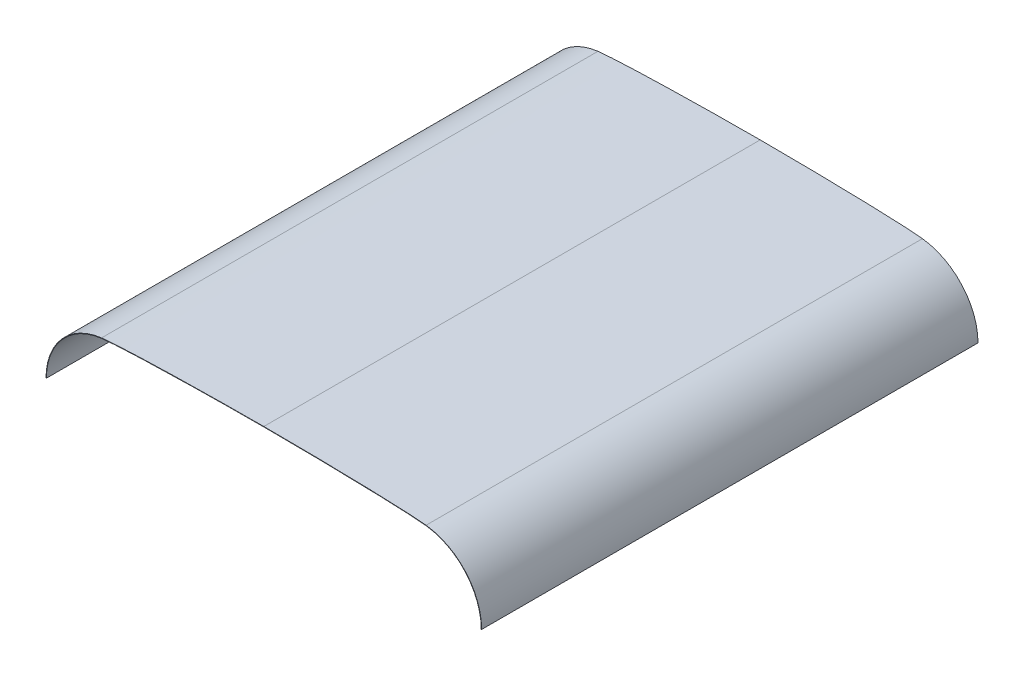
ISO-10303-21;
HEADER;
FILE_DESCRIPTION(('STEP AP214'),'2;1');
FILE_NAME('part.step','',(''),(''),'','','');
FILE_SCHEMA(('AUTOMOTIVE_DESIGN { 1 0 10303 214 1 1 1 1 }'));
ENDSEC;
DATA;
#1=APPLICATION_CONTEXT('core data for automotive mechanical design processes');
#2=APPLICATION_PROTOCOL_DEFINITION('international standard','automotive_design',2000,#1);
#3=PRODUCT_CONTEXT('',#1,'mechanical');
#4=PRODUCT('Part','Part','',(#3));
#5=PRODUCT_RELATED_PRODUCT_CATEGORY('part','',(#4));
#6=PRODUCT_DEFINITION_FORMATION('','',#4);
#7=PRODUCT_DEFINITION_CONTEXT('part definition',#1,'design');
#8=PRODUCT_DEFINITION('design','',#6,#7);
#9=PRODUCT_DEFINITION_SHAPE('','',#8);
#10=(LENGTH_UNIT() NAMED_UNIT(*) SI_UNIT(.MILLI.,.METRE.));
#11=(NAMED_UNIT(*) PLANE_ANGLE_UNIT() SI_UNIT($,.RADIAN.));
#12=(NAMED_UNIT(*) SI_UNIT($,.STERADIAN.) SOLID_ANGLE_UNIT());
#13=UNCERTAINTY_MEASURE_WITH_UNIT(LENGTH_MEASURE(1.E-05),#10,'distance_accuracy_value','');
#14=(GEOMETRIC_REPRESENTATION_CONTEXT(3) GLOBAL_UNCERTAINTY_ASSIGNED_CONTEXT((#13)) GLOBAL_UNIT_ASSIGNED_CONTEXT((#10,
#11,#12)) REPRESENTATION_CONTEXT('',''));
#15=CARTESIAN_POINT('',(0.,0.,0.));
#16=DIRECTION('',(0.,0.,1.));
#17=DIRECTION('',(1.,0.,0.));
#18=AXIS2_PLACEMENT_3D('',#15,#16,#17);
#19=CARTESIAN_POINT('',(1875.,2.22044604925031E-13,0.));
#20=DIRECTION('',(0.,0.,1.));
#21=DIRECTION('',(1.,0.,0.));
#22=AXIS2_PLACEMENT_3D('',#19,#20,#21);
#23=PLANE('',#22);
#24=CARTESIAN_POINT('',(1875.,2.22044604925031E-13,0.));
#25=DIRECTION('',(0.,0.,-1.));
#26=DIRECTION('',(1.,0.,0.));
#27=AXIS2_PLACEMENT_3D('',#24,#25,#26);
#28=CIRCLE('',#27,315.);
#29=CARTESIAN_POINT('',(1911.91539869116,312.829431702761,0.));
#30=VERTEX_POINT('',#29);
#31=CARTESIAN_POINT('',(2190.,0.,0.));
#32=VERTEX_POINT('',#31);
#33=EDGE_CURVE('E184',#30,#32,#28,.T.);
#34=ORIENTED_EDGE('',*,*,#33,.F.);
#35=CARTESIAN_POINT('',(1095.,335.,0.));
#36=CARTESIAN_POINT('',(1377.51055032075,335.,0.));
#37=CARTESIAN_POINT('',(1798.45071959907,326.218817232283,0.));
#38=CARTESIAN_POINT('',(1911.91539869116,312.829431702761,0.));
#39=B_SPLINE_CURVE_WITH_KNOTS('',3,(#35,#36,#37,#38),.UNSPECIFIED.,.F.,.F.,(4,4),(0.,1.),.UNSPECIFIED.);
#40=CARTESIAN_POINT('',(1095.,335.,0.));
#41=VERTEX_POINT('',#40);
#42=EDGE_CURVE('E169',#41,#30,#39,.T.);
#43=ORIENTED_EDGE('',*,*,#42,.F.);
#44=CARTESIAN_POINT('',(278.084601308835,312.829431702761,0.));
#45=CARTESIAN_POINT('',(391.549280400928,326.218817232283,0.));
#46=CARTESIAN_POINT('',(812.489449679245,335.,0.));
#47=CARTESIAN_POINT('',(1095.,335.,0.));
#48=B_SPLINE_CURVE_WITH_KNOTS('',3,(#44,#45,#46,#47),.UNSPECIFIED.,.F.,.F.,(4,4),(0.,1.),.UNSPECIFIED.);
#49=CARTESIAN_POINT('',(278.084601308835,312.829431702761,0.));
#50=VERTEX_POINT('',#49);
#51=EDGE_CURVE('E157',#50,#41,#48,.T.);
#52=ORIENTED_EDGE('',*,*,#51,.F.);
#53=CARTESIAN_POINT('',(315.,2.22044604925031E-13,0.));
#54=DIRECTION('',(0.,0.,-1.));
#55=DIRECTION('',(-1.,0.,0.));
#56=AXIS2_PLACEMENT_3D('',#53,#54,#55);
#57=CIRCLE('',#56,315.);
#58=CARTESIAN_POINT('',(0.,0.,0.));
#59=VERTEX_POINT('',#58);
#60=EDGE_CURVE('E114',#59,#50,#57,.T.);
#61=ORIENTED_EDGE('',*,*,#60,.F.);
#62=DIRECTION('',(1.,0.,0.));
#63=VECTOR('',#62,1.);
#64=CARTESIAN_POINT('',(0.,0.,0.));
#65=LINE('',#64,#63);
#66=CARTESIAN_POINT('',(-2.,0.,0.));
#67=VERTEX_POINT('',#66);
#68=EDGE_CURVE('E11',#67,#59,#65,.T.);
#69=ORIENTED_EDGE('',*,*,#68,.F.);
#70=CARTESIAN_POINT('',(315.,2.22044604925031E-13,0.));
#71=DIRECTION('',(0.,0.,1.));
#72=DIRECTION('',(1.,0.,0.));
#73=AXIS2_PLACEMENT_3D('',#70,#71,#72);
#74=CIRCLE('',#73,317.);
#75=CARTESIAN_POINT('',(277.850217825082,314.815650316747,0.));
#76=VERTEX_POINT('',#75);
#77=EDGE_CURVE('E111',#67,#76,#74,.F.);
#78=ORIENTED_EDGE('',*,*,#77,.T.);
#79=CARTESIAN_POINT('',(277.850217824988,314.815650316736,0.));
#80=CARTESIAN_POINT('',(279.703268444272,315.034015824712,0.));
#81=CARTESIAN_POINT('',(281.557471758241,315.242276572003,0.));
#82=CARTESIAN_POINT('',(285.411440863545,315.657546676967,0.));
#83=CARTESIAN_POINT('',(287.411352326578,315.863208514072,0.));
#84=CARTESIAN_POINT('',(291.553544960059,316.273386664827,0.));
#85=CARTESIAN_POINT('',(293.695934102661,316.476802397689,0.));
#86=CARTESIAN_POINT('',(298.119894808156,316.882161628899,0.));
#87=CARTESIAN_POINT('',(300.401551876935,317.083168178554,0.));
#88=CARTESIAN_POINT('',(307.649382506052,317.700950462304,0.));
#89=CARTESIAN_POINT('',(312.617615317757,318.093535731988,0.));
#90=CARTESIAN_POINT('',(323.071045164372,318.874231530178,0.));
#91=CARTESIAN_POINT('',(328.556583647828,319.257682945674,0.));
#92=CARTESIAN_POINT('',(340.018014246269,320.018497502654,0.));
#93=CARTESIAN_POINT('',(345.994141767944,320.392288337764,0.));
#94=CARTESIAN_POINT('',(358.409889993534,321.132680458143,0.));
#95=CARTESIAN_POINT('',(364.849675142215,321.496498910867,0.));
#96=CARTESIAN_POINT('',(378.165771665133,322.216034600558,0.));
#97=CARTESIAN_POINT('',(385.042201448877,322.569546585799,0.));
#98=CARTESIAN_POINT('',(399.204540985625,323.267730339523,0.));
#99=CARTESIAN_POINT('',(406.490537446226,323.61063294238,0.));
#100=CARTESIAN_POINT('',(421.444916781301,324.286982315709,0.));
#101=CARTESIAN_POINT('',(429.113364178316,324.618996014535,0.));
#102=CARTESIAN_POINT('',(444.805519462116,325.272977421588,0.));
#103=CARTESIAN_POINT('',(452.82927594885,325.593772734398,0.));
#104=CARTESIAN_POINT('',(477.856452976238,326.558515722935,0.));
#105=CARTESIAN_POINT('',(494.861419941114,327.1623983457,0.));
#106=CARTESIAN_POINT('',(529.96627486087,328.32836940408,0.));
#107=CARTESIAN_POINT('',(548.066331768099,328.885281652581,0.));
#108=CARTESIAN_POINT('',(585.143955012094,329.953149634646,0.));
#109=CARTESIAN_POINT('',(604.121622269582,330.460579892347,0.));
#110=CARTESIAN_POINT('',(642.736921225154,331.42610177923,0.));
#111=CARTESIAN_POINT('',(662.374610543212,331.881871353966,0.));
#112=CARTESIAN_POINT('',(702.092361820329,332.74098614218,0.));
#113=CARTESIAN_POINT('',(722.172454075721,333.142924135144,0.));
#114=CARTESIAN_POINT('',(762.557383452306,333.891530530096,0.));
#115=CARTESIAN_POINT('',(782.86223286567,334.237533511743,0.));
#116=CARTESIAN_POINT('',(823.479031080057,334.871550144637,0.));
#117=CARTESIAN_POINT('',(843.790980157284,335.159546074187,0.));
#118=CARTESIAN_POINT('',(884.204324467513,335.674896413145,0.));
#119=CARTESIAN_POINT('',(904.305712040975,335.902850468241,0.));
#120=CARTESIAN_POINT('',(944.080278340889,336.295456291261,0.));
#121=CARTESIAN_POINT('',(963.753444724384,336.461354651287,0.));
#122=CARTESIAN_POINT('',(1002.45393071942,336.72717672413,0.));
#123=CARTESIAN_POINT('',(1021.48123630702,336.829088707893,0.));
#124=CARTESIAN_POINT('',(1049.71206216387,336.93148188692,0.));
#125=CARTESIAN_POINT('',(1058.91549370773,336.957165528166,0.));
#126=CARTESIAN_POINT('',(1077.07928265812,336.991174724445,0.));
#127=CARTESIAN_POINT('',(1086.03963925201,336.999940866,0.));
#128=CARTESIAN_POINT('',(1095.,337.,0.));
#129=B_SPLINE_CURVE_WITH_KNOTS('',3,(#79,#80,#81,#82,#83,#84,#85,#86,#87,#88,#89,#90,#91,#92,
#93,#94,#95,#96,#97,#98,#99,#100,#101,#102,#103,#104,#105,#106,#107,#108,#109,#110,#111,#112,
#113,#114,#115,#116,#117,#118,#119,#120,#121,#122,#123,#124,#125,#126,#127,#128),.UNSPECIFIED.,
.F.,.F.,(4,2,2,2,2,2,2,2,2,2,2,2,2,2,2,2,2,2,2,2,2,2,2,2,4),(0.,5.5975347581268,
11.6288236629455,18.0848441110342,24.9562818347013,39.9071341799279,56.4037433463254,
74.3670258441919,93.7170919420701,114.373548506466,136.255673060189,159.282519265628,
183.372983718783,234.419772760957,288.745482228152,345.698695338025,404.627519635269,
464.879768649554,525.803074566721,586.744964986069,647.052922007574,706.074435652355,
763.157062098526,790.767450636984,817.648521989434),.UNSPECIFIED.);
#130=CARTESIAN_POINT('',(1095.,337.,0.));
#131=VERTEX_POINT('',#130);
#132=EDGE_CURVE('E138',#76,#131,#129,.T.);
#133=ORIENTED_EDGE('',*,*,#132,.T.);
#134=CARTESIAN_POINT('',(1094.99999999993,337.,0.));
#135=CARTESIAN_POINT('',(1103.96036074797,336.999940866001,0.));
#136=CARTESIAN_POINT('',(1112.9207173419,336.991174724445,0.));
#137=CARTESIAN_POINT('',(1131.08450629233,336.957165528166,0.));
#138=CARTESIAN_POINT('',(1140.28793783619,336.931481886919,0.));
#139=CARTESIAN_POINT('',(1168.51876369305,336.829088707892,0.));
#140=CARTESIAN_POINT('',(1187.54606928064,336.72717672413,0.));
#141=CARTESIAN_POINT('',(1226.24655527571,336.461354651287,0.));
#142=CARTESIAN_POINT('',(1245.91972165925,336.29545629126,0.));
#143=CARTESIAN_POINT('',(1285.6942879591,335.90285046824,0.));
#144=CARTESIAN_POINT('',(1305.79567553247,335.674896413145,0.));
#145=CARTESIAN_POINT('',(1346.20901984262,335.159546074188,0.));
#146=CARTESIAN_POINT('',(1366.52096891986,334.871550144638,0.));
#147=CARTESIAN_POINT('',(1407.13776713424,334.237533511744,0.));
#148=CARTESIAN_POINT('',(1427.44261654758,333.891530530098,0.));
#149=CARTESIAN_POINT('',(1467.82754592413,333.142924135147,0.));
#150=CARTESIAN_POINT('',(1487.9076381795,332.740986142183,0.));
#151=CARTESIAN_POINT('',(1527.6253894566,331.88187135397,0.));
#152=CARTESIAN_POINT('',(1547.26307877466,331.426101779234,0.));
#153=CARTESIAN_POINT('',(1585.87837773023,330.460579892352,0.));
#154=CARTESIAN_POINT('',(1604.85604498772,329.953149634651,0.));
#155=CARTESIAN_POINT('',(1641.93366823167,328.885281652588,0.));
#156=CARTESIAN_POINT('',(1660.03372513885,328.328369404089,0.));
#157=CARTESIAN_POINT('',(1695.13858005865,327.162398345708,0.));
#158=CARTESIAN_POINT('',(1712.14354702361,326.55851572294,0.));
#159=CARTESIAN_POINT('',(1737.17072405103,325.593772734403,0.));
#160=CARTESIAN_POINT('',(1745.19448053772,325.272977421594,0.));
#161=CARTESIAN_POINT('',(1760.88663582154,324.618996014542,0.));
#162=CARTESIAN_POINT('',(1768.55508321863,324.286982315712,0.));
#163=CARTESIAN_POINT('',(1783.50946255383,323.610632942378,0.));
#164=CARTESIAN_POINT('',(1790.79545901449,323.267730339518,0.));
#165=CARTESIAN_POINT('',(1804.95779855129,322.569546585791,0.));
#166=CARTESIAN_POINT('',(1811.83422833502,322.21603460055,0.));
#167=CARTESIAN_POINT('',(1825.15032485788,321.496498910861,0.));
#168=CARTESIAN_POINT('',(1831.59011000652,321.13268045814,0.));
#169=CARTESIAN_POINT('',(1844.00585823209,320.392288337762,0.));
#170=CARTESIAN_POINT('',(1849.9819857538,320.01849750265,0.));
#171=CARTESIAN_POINT('',(1861.44341635227,319.257682945667,0.));
#172=CARTESIAN_POINT('',(1866.92895483572,318.874231530172,0.));
#173=CARTESIAN_POINT('',(1877.38238468235,318.09353573198,0.));
#174=CARTESIAN_POINT('',(1882.35061749406,317.700950462295,0.));
#175=CARTESIAN_POINT('',(1889.59844812311,317.08316817855,0.));
#176=CARTESIAN_POINT('',(1891.88010519181,316.882161628902,0.));
#177=CARTESIAN_POINT('',(1896.30406589739,316.476802397684,0.));
#178=CARTESIAN_POINT('',(1898.44645504017,316.273386664806,0.));
#179=CARTESIAN_POINT('',(1902.58864767369,315.863208514044,0.));
#180=CARTESIAN_POINT('',(1904.5885591366,315.657546676952,0.));
#181=CARTESIAN_POINT('',(1908.44252824166,315.242276572014,0.));
#182=CARTESIAN_POINT('',(1910.29673155551,315.034015824736,0.));
#183=CARTESIAN_POINT('',(1912.14978217468,314.815650316774,0.));
#184=B_SPLINE_CURVE_WITH_KNOTS('',3,(#134,#135,#136,#137,#138,#139,#140,#141,#142,#143,#144,
#145,#146,#147,#148,#149,#150,#151,#152,#153,#154,#155,#156,#157,#158,#159,#160,#161,#162,#163,
#164,#165,#166,#167,#168,#169,#170,#171,#172,#173,#174,#175,#176,#177,#178,#179,#180,#181,#182,
#183),.UNSPECIFIED.,.F.,.F.,(4,2,2,2,2,2,2,2,2,2,2,2,2,2,2,2,2,2,2,2,2,2,2,2,4),(0.,
26.8810713525795,54.4914598910363,111.574086337204,170.5955999821,230.903557003317,
291.845447422713,352.768753339814,413.021002354046,471.949826651293,528.903039761157,
583.228749228223,634.275538270654,658.366002723651,681.39284892931,703.274973483204,
723.931430047579,743.281496145308,761.244778643275,777.741387809666,792.692240154921,
799.563677878346,806.019698326956,812.050987231389,817.648521989169),.UNSPECIFIED.);
#185=CARTESIAN_POINT('',(1912.14978217492,314.815650316747,0.));
#186=VERTEX_POINT('',#185);
#187=EDGE_CURVE('E228',#131,#186,#184,.T.);
#188=ORIENTED_EDGE('',*,*,#187,.T.);
#189=CARTESIAN_POINT('',(1875.,2.22044604925031E-13,0.));
#190=DIRECTION('',(0.,0.,1.));
#191=DIRECTION('',(1.,0.,0.));
#192=AXIS2_PLACEMENT_3D('',#189,#190,#191);
#193=CIRCLE('',#192,317.);
#194=CARTESIAN_POINT('',(2192.,0.,0.));
#195=VERTEX_POINT('',#194);
#196=EDGE_CURVE('E255',#186,#195,#193,.F.);
#197=ORIENTED_EDGE('',*,*,#196,.T.);
#198=DIRECTION('',(-1.,0.,0.));
#199=VECTOR('',#198,1.);
#200=CARTESIAN_POINT('',(2190.,0.,0.));
#201=LINE('',#200,#199);
#202=EDGE_CURVE('E52',#195,#32,#201,.T.);
#203=ORIENTED_EDGE('',*,*,#202,.T.);
#204=EDGE_LOOP('',(#34,#43,#52,#61,#69,#78,#133,#188,#197,#203));
#205=FACE_BOUND('',#204,.T.);
#206=ADVANCED_FACE('F41',(#205),#23,.F.);
#207=CARTESIAN_POINT('',(2190.,0.,1250.));
#208=DIRECTION('',(0.,1.,0.));
#209=DIRECTION('',(0.,0.,1.));
#210=AXIS2_PLACEMENT_3D('',#207,#208,#209);
#211=PLANE('',#210);
#212=ORIENTED_EDGE('',*,*,#202,.F.);
#213=DIRECTION('',(0.,0.,1.));
#214=VECTOR('',#213,1.);
#215=CARTESIAN_POINT('',(2192.,0.,0.));
#216=LINE('',#215,#214);
#217=CARTESIAN_POINT('',(2192.,0.,2500.));
#218=VERTEX_POINT('',#217);
#219=EDGE_CURVE('E241',#195,#218,#216,.T.);
#220=ORIENTED_EDGE('',*,*,#219,.T.);
#221=DIRECTION('',(-1.,0.,0.));
#222=VECTOR('',#221,1.);
#223=CARTESIAN_POINT('',(2190.,0.,2500.));
#224=LINE('',#223,#222);
#225=CARTESIAN_POINT('',(2190.,0.,2500.));
#226=VERTEX_POINT('',#225);
#227=EDGE_CURVE('E143',#218,#226,#224,.T.);
#228=ORIENTED_EDGE('',*,*,#227,.T.);
#229=DIRECTION('',(0.,0.,1.));
#230=VECTOR('',#229,1.);
#231=CARTESIAN_POINT('',(2190.,0.,0.));
#232=LINE('',#231,#230);
#233=EDGE_CURVE('E180',#32,#226,#232,.T.);
#234=ORIENTED_EDGE('',*,*,#233,.F.);
#235=EDGE_LOOP('',(#212,#220,#228,#234));
#236=FACE_BOUND('',#235,.T.);
#237=ADVANCED_FACE('F281',(#236),#211,.F.);
#238=CARTESIAN_POINT('',(315.,2.22044604925031E-13,2500.));
#239=DIRECTION('',(0.,0.,1.));
#240=DIRECTION('',(1.,0.,0.));
#241=AXIS2_PLACEMENT_3D('',#238,#239,#240);
#242=PLANE('',#241);
#243=CARTESIAN_POINT('',(315.,2.22044604925031E-13,2500.));
#244=DIRECTION('',(0.,0.,-1.));
#245=DIRECTION('',(-1.,0.,0.));
#246=AXIS2_PLACEMENT_3D('',#243,#244,#245);
#247=CIRCLE('',#246,315.);
#248=CARTESIAN_POINT('',(0.,0.,2500.));
#249=VERTEX_POINT('',#248);
#250=CARTESIAN_POINT('',(278.084601308835,312.829431702761,2500.));
#251=VERTEX_POINT('',#250);
#252=EDGE_CURVE('E153',#249,#251,#247,.T.);
#253=ORIENTED_EDGE('',*,*,#252,.T.);
#254=CARTESIAN_POINT('',(278.084601308835,312.829431702761,2500.));
#255=CARTESIAN_POINT('',(391.549280400928,326.218817232283,2500.));
#256=CARTESIAN_POINT('',(812.489449679245,335.,2500.));
#257=CARTESIAN_POINT('',(1095.,335.,2500.));
#258=B_SPLINE_CURVE_WITH_KNOTS('',3,(#254,#255,#256,#257),.UNSPECIFIED.,.F.,.F.,(4,4),(0.,1.),.UNSPECIFIED.);
#259=CARTESIAN_POINT('',(1095.,335.,2500.));
#260=VERTEX_POINT('',#259);
#261=EDGE_CURVE('E165',#251,#260,#258,.T.);
#262=ORIENTED_EDGE('',*,*,#261,.T.);
#263=CARTESIAN_POINT('',(1095.,335.,2500.));
#264=CARTESIAN_POINT('',(1377.51055032075,335.,2500.));
#265=CARTESIAN_POINT('',(1798.45071959907,326.218817232283,2500.));
#266=CARTESIAN_POINT('',(1911.91539869116,312.829431702761,2500.));
#267=B_SPLINE_CURVE_WITH_KNOTS('',3,(#263,#264,#265,#266),.UNSPECIFIED.,.F.,.F.,(4,4),(0.,1.),.UNSPECIFIED.);
#268=CARTESIAN_POINT('',(1911.91539869116,312.829431702761,2500.));
#269=VERTEX_POINT('',#268);
#270=EDGE_CURVE('E176',#260,#269,#267,.T.);
#271=ORIENTED_EDGE('',*,*,#270,.T.);
#272=CARTESIAN_POINT('',(1875.,2.22044604925031E-13,2500.));
#273=DIRECTION('',(0.,0.,-1.));
#274=DIRECTION('',(1.,0.,0.));
#275=AXIS2_PLACEMENT_3D('',#272,#273,#274);
#276=CIRCLE('',#275,315.);
#277=EDGE_CURVE('E131',#269,#226,#276,.T.);
#278=ORIENTED_EDGE('',*,*,#277,.T.);
#279=ORIENTED_EDGE('',*,*,#227,.F.);
#280=CARTESIAN_POINT('',(1875.,2.22044604925031E-13,2500.));
#281=DIRECTION('',(0.,0.,1.));
#282=DIRECTION('',(1.,0.,0.));
#283=AXIS2_PLACEMENT_3D('',#280,#281,#282);
#284=CIRCLE('',#283,317.);
#285=CARTESIAN_POINT('',(1912.14978217492,314.815650316747,2500.));
#286=VERTEX_POINT('',#285);
#287=EDGE_CURVE('E242',#286,#218,#284,.F.);
#288=ORIENTED_EDGE('',*,*,#287,.F.);
#289=CARTESIAN_POINT('',(1094.99999999993,337.,2500.));
#290=CARTESIAN_POINT('',(1103.96036074797,336.999940866001,2500.));
#291=CARTESIAN_POINT('',(1112.9207173419,336.991174724445,2500.));
#292=CARTESIAN_POINT('',(1131.08450629233,336.957165528166,2500.));
#293=CARTESIAN_POINT('',(1140.28793783619,336.931481886919,2500.));
#294=CARTESIAN_POINT('',(1168.51876369305,336.829088707892,2500.));
#295=CARTESIAN_POINT('',(1187.54606928064,336.72717672413,2500.));
#296=CARTESIAN_POINT('',(1226.24655527571,336.461354651287,2500.));
#297=CARTESIAN_POINT('',(1245.91972165925,336.29545629126,2500.));
#298=CARTESIAN_POINT('',(1285.6942879591,335.90285046824,2500.));
#299=CARTESIAN_POINT('',(1305.79567553247,335.674896413145,2500.));
#300=CARTESIAN_POINT('',(1346.20901984262,335.159546074188,2500.));
#301=CARTESIAN_POINT('',(1366.52096891986,334.871550144638,2500.));
#302=CARTESIAN_POINT('',(1407.13776713424,334.237533511744,2500.));
#303=CARTESIAN_POINT('',(1427.44261654758,333.891530530098,2500.));
#304=CARTESIAN_POINT('',(1467.82754592413,333.142924135147,2500.));
#305=CARTESIAN_POINT('',(1487.9076381795,332.740986142183,2500.));
#306=CARTESIAN_POINT('',(1527.6253894566,331.88187135397,2500.));
#307=CARTESIAN_POINT('',(1547.26307877466,331.426101779234,2500.));
#308=CARTESIAN_POINT('',(1585.87837773023,330.460579892352,2500.));
#309=CARTESIAN_POINT('',(1604.85604498772,329.953149634651,2500.));
#310=CARTESIAN_POINT('',(1641.93366823167,328.885281652588,2500.));
#311=CARTESIAN_POINT('',(1660.03372513885,328.328369404089,2500.));
#312=CARTESIAN_POINT('',(1695.13858005865,327.162398345708,2500.));
#313=CARTESIAN_POINT('',(1712.14354702361,326.55851572294,2500.));
#314=CARTESIAN_POINT('',(1737.17072405103,325.593772734403,2500.));
#315=CARTESIAN_POINT('',(1745.19448053772,325.272977421594,2500.));
#316=CARTESIAN_POINT('',(1760.88663582154,324.618996014542,2500.));
#317=CARTESIAN_POINT('',(1768.55508321863,324.286982315712,2500.));
#318=CARTESIAN_POINT('',(1783.50946255383,323.610632942378,2500.));
#319=CARTESIAN_POINT('',(1790.79545901449,323.267730339518,2500.));
#320=CARTESIAN_POINT('',(1804.95779855129,322.569546585791,2500.));
#321=CARTESIAN_POINT('',(1811.83422833502,322.21603460055,2500.));
#322=CARTESIAN_POINT('',(1825.15032485788,321.496498910861,2500.));
#323=CARTESIAN_POINT('',(1831.59011000652,321.13268045814,2500.));
#324=CARTESIAN_POINT('',(1844.00585823209,320.392288337762,2500.));
#325=CARTESIAN_POINT('',(1849.9819857538,320.01849750265,2500.));
#326=CARTESIAN_POINT('',(1861.44341635227,319.257682945667,2500.));
#327=CARTESIAN_POINT('',(1866.92895483572,318.874231530172,2500.));
#328=CARTESIAN_POINT('',(1877.38238468235,318.09353573198,2500.));
#329=CARTESIAN_POINT('',(1882.35061749406,317.700950462295,2500.));
#330=CARTESIAN_POINT('',(1889.59844812311,317.08316817855,2500.));
#331=CARTESIAN_POINT('',(1891.88010519181,316.882161628902,2500.));
#332=CARTESIAN_POINT('',(1896.30406589739,316.476802397684,2500.));
#333=CARTESIAN_POINT('',(1898.44645504017,316.273386664806,2500.));
#334=CARTESIAN_POINT('',(1902.58864767369,315.863208514044,2500.));
#335=CARTESIAN_POINT('',(1904.5885591366,315.657546676952,2500.));
#336=CARTESIAN_POINT('',(1908.44252824166,315.242276572014,2500.));
#337=CARTESIAN_POINT('',(1910.29673155551,315.034015824736,2500.));
#338=CARTESIAN_POINT('',(1912.14978217468,314.815650316774,2500.));
#339=B_SPLINE_CURVE_WITH_KNOTS('',3,(#289,#290,#291,#292,#293,#294,#295,#296,#297,#298,#299,
#300,#301,#302,#303,#304,#305,#306,#307,#308,#309,#310,#311,#312,#313,#314,#315,#316,#317,#318,
#319,#320,#321,#322,#323,#324,#325,#326,#327,#328,#329,#330,#331,#332,#333,#334,#335,#336,#337,
#338),.UNSPECIFIED.,.F.,.F.,(4,2,2,2,2,2,2,2,2,2,2,2,2,2,2,2,2,2,2,2,2,2,2,2,4),(0.,
26.8810713525795,54.4914598910363,111.574086337204,170.5955999821,230.903557003317,
291.845447422713,352.768753339814,413.021002354046,471.949826651293,528.903039761157,
583.228749228223,634.275538270654,658.366002723651,681.39284892931,703.274973483204,
723.931430047579,743.281496145308,761.244778643275,777.741387809666,792.692240154921,
799.563677878346,806.019698326956,812.050987231389,817.648521989169),.UNSPECIFIED.);
#340=CARTESIAN_POINT('',(1095.,337.,2500.));
#341=VERTEX_POINT('',#340);
#342=EDGE_CURVE('E230',#341,#286,#339,.T.);
#343=ORIENTED_EDGE('',*,*,#342,.F.);
#344=CARTESIAN_POINT('',(277.850217824988,314.815650316736,2500.));
#345=CARTESIAN_POINT('',(279.703268444272,315.034015824712,2500.));
#346=CARTESIAN_POINT('',(281.557471758241,315.242276572003,2500.));
#347=CARTESIAN_POINT('',(285.411440863545,315.657546676967,2500.));
#348=CARTESIAN_POINT('',(287.411352326578,315.863208514072,2500.));
#349=CARTESIAN_POINT('',(291.553544960059,316.273386664827,2500.));
#350=CARTESIAN_POINT('',(293.695934102661,316.476802397689,2500.));
#351=CARTESIAN_POINT('',(298.119894808156,316.882161628899,2500.));
#352=CARTESIAN_POINT('',(300.401551876935,317.083168178554,2500.));
#353=CARTESIAN_POINT('',(307.649382506052,317.700950462304,2500.));
#354=CARTESIAN_POINT('',(312.617615317757,318.093535731988,2500.));
#355=CARTESIAN_POINT('',(323.071045164372,318.874231530178,2500.));
#356=CARTESIAN_POINT('',(328.556583647828,319.257682945674,2500.));
#357=CARTESIAN_POINT('',(340.018014246269,320.018497502654,2500.));
#358=CARTESIAN_POINT('',(345.994141767944,320.392288337764,2500.));
#359=CARTESIAN_POINT('',(358.409889993534,321.132680458143,2500.));
#360=CARTESIAN_POINT('',(364.849675142215,321.496498910867,2500.));
#361=CARTESIAN_POINT('',(378.165771665133,322.216034600558,2500.));
#362=CARTESIAN_POINT('',(385.042201448877,322.569546585799,2500.));
#363=CARTESIAN_POINT('',(399.204540985625,323.267730339523,2500.));
#364=CARTESIAN_POINT('',(406.490537446226,323.61063294238,2500.));
#365=CARTESIAN_POINT('',(421.444916781301,324.286982315709,2500.));
#366=CARTESIAN_POINT('',(429.113364178316,324.618996014535,2500.));
#367=CARTESIAN_POINT('',(444.805519462116,325.272977421588,2500.));
#368=CARTESIAN_POINT('',(452.82927594885,325.593772734398,2500.));
#369=CARTESIAN_POINT('',(477.856452976238,326.558515722935,2500.));
#370=CARTESIAN_POINT('',(494.861419941114,327.1623983457,2500.));
#371=CARTESIAN_POINT('',(529.96627486087,328.32836940408,2500.));
#372=CARTESIAN_POINT('',(548.066331768099,328.885281652581,2500.));
#373=CARTESIAN_POINT('',(585.143955012094,329.953149634646,2500.));
#374=CARTESIAN_POINT('',(604.121622269582,330.460579892347,2500.));
#375=CARTESIAN_POINT('',(642.736921225154,331.42610177923,2500.));
#376=CARTESIAN_POINT('',(662.374610543212,331.881871353966,2500.));
#377=CARTESIAN_POINT('',(702.092361820329,332.74098614218,2500.));
#378=CARTESIAN_POINT('',(722.172454075721,333.142924135144,2500.));
#379=CARTESIAN_POINT('',(762.557383452306,333.891530530096,2500.));
#380=CARTESIAN_POINT('',(782.86223286567,334.237533511743,2500.));
#381=CARTESIAN_POINT('',(823.479031080057,334.871550144637,2500.));
#382=CARTESIAN_POINT('',(843.790980157284,335.159546074187,2500.));
#383=CARTESIAN_POINT('',(884.204324467513,335.674896413145,2500.));
#384=CARTESIAN_POINT('',(904.305712040975,335.902850468241,2500.));
#385=CARTESIAN_POINT('',(944.080278340889,336.295456291261,2500.));
#386=CARTESIAN_POINT('',(963.753444724384,336.461354651287,2500.));
#387=CARTESIAN_POINT('',(1002.45393071942,336.72717672413,2500.));
#388=CARTESIAN_POINT('',(1021.48123630702,336.829088707893,2500.));
#389=CARTESIAN_POINT('',(1049.71206216387,336.93148188692,2500.));
#390=CARTESIAN_POINT('',(1058.91549370773,336.957165528166,2500.));
#391=CARTESIAN_POINT('',(1077.07928265812,336.991174724445,2500.));
#392=CARTESIAN_POINT('',(1086.03963925201,336.999940866,2500.));
#393=CARTESIAN_POINT('',(1095.,337.,2500.));
#394=B_SPLINE_CURVE_WITH_KNOTS('',3,(#344,#345,#346,#347,#348,#349,#350,#351,#352,#353,#354,
#355,#356,#357,#358,#359,#360,#361,#362,#363,#364,#365,#366,#367,#368,#369,#370,#371,#372,#373,
#374,#375,#376,#377,#378,#379,#380,#381,#382,#383,#384,#385,#386,#387,#388,#389,#390,#391,#392,
#393),.UNSPECIFIED.,.F.,.F.,(4,2,2,2,2,2,2,2,2,2,2,2,2,2,2,2,2,2,2,2,2,2,2,2,4),(0.,
5.5975347581268,11.6288236629455,18.0848441110342,24.9562818347013,39.9071341799279,
56.4037433463254,74.3670258441919,93.7170919420701,114.373548506466,136.255673060189,
159.282519265628,183.372983718783,234.419772760957,288.745482228152,345.698695338025,
404.627519635269,464.879768649554,525.803074566721,586.744964986069,647.052922007574,
706.074435652355,763.157062098526,790.767450636984,817.648521989434),.UNSPECIFIED.);
#395=CARTESIAN_POINT('',(277.850217825082,314.815650316747,2500.));
#396=VERTEX_POINT('',#395);
#397=EDGE_CURVE('E222',#396,#341,#394,.T.);
#398=ORIENTED_EDGE('',*,*,#397,.F.);
#399=CARTESIAN_POINT('',(315.,2.22044604925031E-13,2500.));
#400=DIRECTION('',(0.,0.,1.));
#401=DIRECTION('',(1.,0.,0.));
#402=AXIS2_PLACEMENT_3D('',#399,#400,#401);
#403=CIRCLE('',#402,317.);
#404=CARTESIAN_POINT('',(-2.,0.,2500.));
#405=VERTEX_POINT('',#404);
#406=EDGE_CURVE('E125',#405,#396,#403,.F.);
#407=ORIENTED_EDGE('',*,*,#406,.F.);
#408=DIRECTION('',(1.,0.,0.));
#409=VECTOR('',#408,1.);
#410=CARTESIAN_POINT('',(0.,0.,2500.));
#411=LINE('',#410,#409);
#412=EDGE_CURVE('E45',#405,#249,#411,.T.);
#413=ORIENTED_EDGE('',*,*,#412,.T.);
#414=EDGE_LOOP('',(#253,#262,#271,#278,#279,#288,#343,#398,#407,#413));
#415=FACE_BOUND('',#414,.T.);
#416=ADVANCED_FACE('F278',(#415),#242,.T.);
#417=CARTESIAN_POINT('',(0.,0.,1250.));
#418=DIRECTION('',(0.,-1.,0.));
#419=DIRECTION('',(0.,0.,1.));
#420=AXIS2_PLACEMENT_3D('',#417,#418,#419);
#421=PLANE('',#420);
#422=DIRECTION('',(0.,0.,1.));
#423=VECTOR('',#422,1.);
#424=CARTESIAN_POINT('',(-2.,0.,0.));
#425=LINE('',#424,#423);
#426=EDGE_CURVE('E120',#67,#405,#425,.T.);
#427=ORIENTED_EDGE('',*,*,#426,.F.);
#428=ORIENTED_EDGE('',*,*,#68,.T.);
#429=DIRECTION('',(0.,0.,1.));
#430=VECTOR('',#429,1.);
#431=CARTESIAN_POINT('',(0.,0.,0.));
#432=LINE('',#431,#430);
#433=EDGE_CURVE('E150',#59,#249,#432,.T.);
#434=ORIENTED_EDGE('',*,*,#433,.T.);
#435=ORIENTED_EDGE('',*,*,#412,.F.);
#436=EDGE_LOOP('',(#427,#428,#434,#435));
#437=FACE_BOUND('',#436,.T.);
#438=ADVANCED_FACE('F43',(#437),#421,.T.);
#439=CARTESIAN_POINT('',(315.,2.22044604925031E-13,0.));
#440=DIRECTION('',(0.,0.,1.));
#441=DIRECTION('',(1.,0.,0.));
#442=AXIS2_PLACEMENT_3D('',#439,#440,#441);
#443=CYLINDRICAL_SURFACE('',#442,315.);
#444=ORIENTED_EDGE('',*,*,#252,.F.);
#445=ORIENTED_EDGE('',*,*,#433,.F.);
#446=ORIENTED_EDGE('',*,*,#60,.T.);
#447=DIRECTION('',(0.,0.,1.));
#448=VECTOR('',#447,1.);
#449=CARTESIAN_POINT('',(278.084601308835,312.829431702761,0.));
#450=LINE('',#449,#448);
#451=EDGE_CURVE('E161',#50,#251,#450,.T.);
#452=ORIENTED_EDGE('',*,*,#451,.T.);
#453=EDGE_LOOP('',(#444,#445,#446,#452));
#454=FACE_BOUND('',#453,.T.);
#455=ADVANCED_FACE('F208',(#454),#443,.F.);
#456=DIRECTION('',(0.,0.,1.));
#457=VECTOR('',#456,1.);
#458=SURFACE_OF_LINEAR_EXTRUSION('',#48,#457);
#459=ORIENTED_EDGE('',*,*,#261,.F.);
#460=ORIENTED_EDGE('',*,*,#451,.F.);
#461=ORIENTED_EDGE('',*,*,#51,.T.);
#462=DIRECTION('',(0.,0.,1.));
#463=VECTOR('',#462,1.);
#464=CARTESIAN_POINT('',(1095.,335.,0.));
#465=LINE('',#464,#463);
#466=EDGE_CURVE('E172',#41,#260,#465,.T.);
#467=ORIENTED_EDGE('',*,*,#466,.T.);
#468=EDGE_LOOP('',(#459,#460,#461,#467));
#469=FACE_BOUND('',#468,.T.);
#470=ADVANCED_FACE('F203',(#469),#458,.T.);
#471=DIRECTION('',(0.,0.,1.));
#472=VECTOR('',#471,1.);
#473=SURFACE_OF_LINEAR_EXTRUSION('',#39,#472);
#474=ORIENTED_EDGE('',*,*,#270,.F.);
#475=ORIENTED_EDGE('',*,*,#466,.F.);
#476=ORIENTED_EDGE('',*,*,#42,.T.);
#477=DIRECTION('',(0.,0.,1.));
#478=VECTOR('',#477,1.);
#479=CARTESIAN_POINT('',(1911.91539869116,312.829431702761,0.));
#480=LINE('',#479,#478);
#481=EDGE_CURVE('E135',#30,#269,#480,.T.);
#482=ORIENTED_EDGE('',*,*,#481,.T.);
#483=EDGE_LOOP('',(#474,#475,#476,#482));
#484=FACE_BOUND('',#483,.T.);
#485=ADVANCED_FACE('F207',(#484),#473,.T.);
#486=CARTESIAN_POINT('',(1875.,2.22044604925031E-13,0.));
#487=DIRECTION('',(0.,0.,1.));
#488=DIRECTION('',(1.,0.,0.));
#489=AXIS2_PLACEMENT_3D('',#486,#487,#488);
#490=CYLINDRICAL_SURFACE('',#489,315.);
#491=ORIENTED_EDGE('',*,*,#277,.F.);
#492=ORIENTED_EDGE('',*,*,#481,.F.);
#493=ORIENTED_EDGE('',*,*,#33,.T.);
#494=ORIENTED_EDGE('',*,*,#233,.T.);
#495=EDGE_LOOP('',(#491,#492,#493,#494));
#496=FACE_BOUND('',#495,.T.);
#497=ADVANCED_FACE('F283',(#496),#490,.F.);
#498=CARTESIAN_POINT('',(315.,2.22044604925031E-13,0.));
#499=DIRECTION('',(0.,0.,1.));
#500=DIRECTION('',(1.,0.,0.));
#501=AXIS2_PLACEMENT_3D('',#498,#499,#500);
#502=CYLINDRICAL_SURFACE('',#501,317.);
#503=ORIENTED_EDGE('',*,*,#406,.T.);
#504=DIRECTION('',(0.,0.,1.));
#505=VECTOR('',#504,1.);
#506=CARTESIAN_POINT('',(277.850217825082,314.815650316747,0.));
#507=LINE('',#506,#505);
#508=EDGE_CURVE('E128',#76,#396,#507,.T.);
#509=ORIENTED_EDGE('',*,*,#508,.F.);
#510=ORIENTED_EDGE('',*,*,#77,.F.);
#511=ORIENTED_EDGE('',*,*,#426,.T.);
#512=EDGE_LOOP('',(#503,#509,#510,#511));
#513=FACE_BOUND('',#512,.T.);
#514=ADVANCED_FACE('F127',(#513),#502,.T.);
#515=CARTESIAN_POINT('',(278.084601308835,312.829431702761,0.));
#516=CARTESIAN_POINT('',(391.549280400928,326.218817232283,0.));
#517=CARTESIAN_POINT('',(812.489449679245,335.,0.));
#518=CARTESIAN_POINT('',(1095.,335.,0.));
#519=B_SPLINE_CURVE_WITH_KNOTS('',3,(#515,#516,#517,#518),.UNSPECIFIED.,.F.,.F.,(4,4),(0.,1.),.UNSPECIFIED.);
#520=DIRECTION('',(0.,0.,1.));
#521=VECTOR('',#520,1.);
#522=SURFACE_OF_LINEAR_EXTRUSION('',#519,#521);
#523=OFFSET_SURFACE('',#522,-2.,.F.);
#524=ORIENTED_EDGE('',*,*,#397,.T.);
#525=DIRECTION('',(0.,0.,1.));
#526=VECTOR('',#525,1.);
#527=CARTESIAN_POINT('',(1095.,337.,0.));
#528=LINE('',#527,#526);
#529=EDGE_CURVE('E240',#131,#341,#528,.T.);
#530=ORIENTED_EDGE('',*,*,#529,.F.);
#531=ORIENTED_EDGE('',*,*,#132,.F.);
#532=ORIENTED_EDGE('',*,*,#508,.T.);
#533=EDGE_LOOP('',(#524,#530,#531,#532));
#534=FACE_BOUND('',#533,.T.);
#535=ADVANCED_FACE('F212',(#534),#523,.F.);
#536=CARTESIAN_POINT('',(1095.,335.,0.));
#537=CARTESIAN_POINT('',(1377.51055032075,335.,0.));
#538=CARTESIAN_POINT('',(1798.45071959907,326.218817232283,0.));
#539=CARTESIAN_POINT('',(1911.91539869116,312.829431702761,0.));
#540=B_SPLINE_CURVE_WITH_KNOTS('',3,(#536,#537,#538,#539),.UNSPECIFIED.,.F.,.F.,(4,4),(0.,1.),.UNSPECIFIED.);
#541=DIRECTION('',(0.,0.,1.));
#542=VECTOR('',#541,1.);
#543=SURFACE_OF_LINEAR_EXTRUSION('',#540,#542);
#544=OFFSET_SURFACE('',#543,-2.,.F.);
#545=ORIENTED_EDGE('',*,*,#342,.T.);
#546=DIRECTION('',(0.,0.,1.));
#547=VECTOR('',#546,1.);
#548=CARTESIAN_POINT('',(1912.14978217492,314.815650316747,0.));
#549=LINE('',#548,#547);
#550=EDGE_CURVE('E251',#186,#286,#549,.T.);
#551=ORIENTED_EDGE('',*,*,#550,.F.);
#552=ORIENTED_EDGE('',*,*,#187,.F.);
#553=ORIENTED_EDGE('',*,*,#529,.T.);
#554=EDGE_LOOP('',(#545,#551,#552,#553));
#555=FACE_BOUND('',#554,.T.);
#556=ADVANCED_FACE('F216',(#555),#544,.F.);
#557=CARTESIAN_POINT('',(1875.,2.22044604925031E-13,0.));
#558=DIRECTION('',(0.,0.,1.));
#559=DIRECTION('',(1.,0.,0.));
#560=AXIS2_PLACEMENT_3D('',#557,#558,#559);
#561=CYLINDRICAL_SURFACE('',#560,317.);
#562=ORIENTED_EDGE('',*,*,#287,.T.);
#563=ORIENTED_EDGE('',*,*,#219,.F.);
#564=ORIENTED_EDGE('',*,*,#196,.F.);
#565=ORIENTED_EDGE('',*,*,#550,.T.);
#566=EDGE_LOOP('',(#562,#563,#564,#565));
#567=FACE_BOUND('',#566,.T.);
#568=ADVANCED_FACE('F272',(#567),#561,.T.);
#569=CLOSED_SHELL('',(#206,#237,#416,#438,#455,#470,#485,#497,#514,#535,#556,#568));
#570=MANIFOLD_SOLID_BREP('B2',#569);
#571=ADVANCED_BREP_SHAPE_REPRESENTATION('',(#18,#570),#14);
#572=SHAPE_DEFINITION_REPRESENTATION(#9,#571);
ENDSEC;
END-ISO-10303-21;
